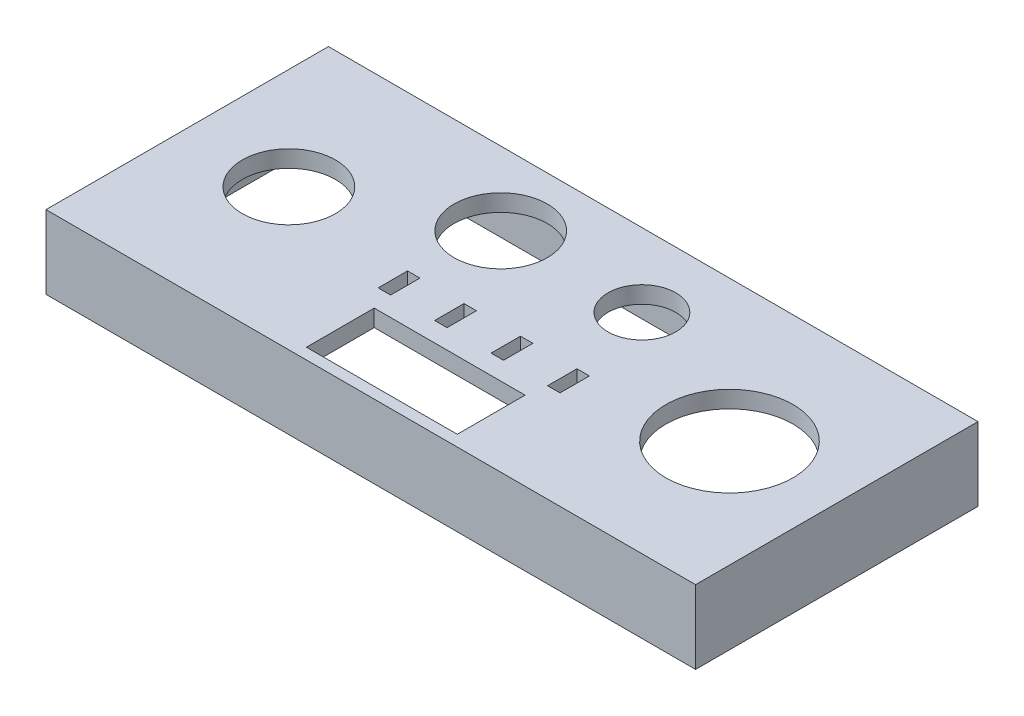
ISO-10303-21;
HEADER;
FILE_DESCRIPTION(('STEP AP214'),'2;1');
FILE_NAME('part.step','',(''),(''),'','','');
FILE_SCHEMA(('AUTOMOTIVE_DESIGN { 1 0 10303 214 1 1 1 1 }'));
ENDSEC;
DATA;
#1=APPLICATION_CONTEXT('core data for automotive mechanical design processes');
#2=APPLICATION_PROTOCOL_DEFINITION('international standard','automotive_design',2000,#1);
#3=PRODUCT_CONTEXT('',#1,'mechanical');
#4=PRODUCT('Part','Part','',(#3));
#5=PRODUCT_RELATED_PRODUCT_CATEGORY('part','',(#4));
#6=PRODUCT_DEFINITION_FORMATION('','',#4);
#7=PRODUCT_DEFINITION_CONTEXT('part definition',#1,'design');
#8=PRODUCT_DEFINITION('design','',#6,#7);
#9=PRODUCT_DEFINITION_SHAPE('','',#8);
#10=(LENGTH_UNIT() NAMED_UNIT(*) SI_UNIT(.MILLI.,.METRE.));
#11=(NAMED_UNIT(*) PLANE_ANGLE_UNIT() SI_UNIT($,.RADIAN.));
#12=(NAMED_UNIT(*) SI_UNIT($,.STERADIAN.) SOLID_ANGLE_UNIT());
#13=UNCERTAINTY_MEASURE_WITH_UNIT(LENGTH_MEASURE(1.E-05),#10,'distance_accuracy_value','');
#14=(GEOMETRIC_REPRESENTATION_CONTEXT(3) GLOBAL_UNCERTAINTY_ASSIGNED_CONTEXT((#13)) GLOBAL_UNIT_ASSIGNED_CONTEXT((#10,
#11,#12)) REPRESENTATION_CONTEXT('',''));
#15=CARTESIAN_POINT('',(0.,0.,0.));
#16=DIRECTION('',(0.,0.,1.));
#17=DIRECTION('',(1.,0.,0.));
#18=AXIS2_PLACEMENT_3D('',#15,#16,#17);
#19=CARTESIAN_POINT('',(57.5,13.,-25.));
#20=DIRECTION('',(-1.,0.,0.));
#21=DIRECTION('',(0.,0.,1.));
#22=AXIS2_PLACEMENT_3D('',#19,#20,#21);
#23=PLANE('',#22);
#24=DIRECTION('',(0.,0.,-1.));
#25=VECTOR('',#24,1.);
#26=CARTESIAN_POINT('',(57.5,0.,-25.));
#27=LINE('',#26,#25);
#28=CARTESIAN_POINT('',(57.5,0.,25.));
#29=VERTEX_POINT('',#28);
#30=CARTESIAN_POINT('',(57.5,0.,-25.));
#31=VERTEX_POINT('',#30);
#32=EDGE_CURVE('E424',#29,#31,#27,.T.);
#33=ORIENTED_EDGE('',*,*,#32,.T.);
#34=DIRECTION('',(0.,-1.,0.));
#35=VECTOR('',#34,1.);
#36=CARTESIAN_POINT('',(57.5,13.,-25.));
#37=LINE('',#36,#35);
#38=CARTESIAN_POINT('',(57.5,13.,-25.));
#39=VERTEX_POINT('',#38);
#40=EDGE_CURVE('E471',#39,#31,#37,.T.);
#41=ORIENTED_EDGE('',*,*,#40,.F.);
#42=DIRECTION('',(0.,0.,-1.));
#43=VECTOR('',#42,1.);
#44=CARTESIAN_POINT('',(57.5,13.,-25.));
#45=LINE('',#44,#43);
#46=CARTESIAN_POINT('',(57.5,13.,25.));
#47=VERTEX_POINT('',#46);
#48=EDGE_CURVE('E434',#47,#39,#45,.T.);
#49=ORIENTED_EDGE('',*,*,#48,.F.);
#50=DIRECTION('',(0.,-1.,0.));
#51=VECTOR('',#50,1.);
#52=CARTESIAN_POINT('',(57.5,13.,25.));
#53=LINE('',#52,#51);
#54=EDGE_CURVE('E448',#47,#29,#53,.T.);
#55=ORIENTED_EDGE('',*,*,#54,.T.);
#56=EDGE_LOOP('',(#33,#41,#49,#55));
#57=FACE_BOUND('',#56,.T.);
#58=ADVANCED_FACE('F39',(#57),#23,.F.);
#59=CARTESIAN_POINT('',(-57.5,13.,-25.));
#60=DIRECTION('',(0.,0.,1.));
#61=DIRECTION('',(1.,0.,0.));
#62=AXIS2_PLACEMENT_3D('',#59,#60,#61);
#63=PLANE('',#62);
#64=DIRECTION('',(-1.,0.,0.));
#65=VECTOR('',#64,1.);
#66=CARTESIAN_POINT('',(-57.5,0.,-25.));
#67=LINE('',#66,#65);
#68=CARTESIAN_POINT('',(-57.5,0.,-25.));
#69=VERTEX_POINT('',#68);
#70=EDGE_CURVE('E452',#31,#69,#67,.T.);
#71=ORIENTED_EDGE('',*,*,#70,.T.);
#72=DIRECTION('',(0.,-1.,0.));
#73=VECTOR('',#72,1.);
#74=CARTESIAN_POINT('',(-57.5,13.,-25.));
#75=LINE('',#74,#73);
#76=CARTESIAN_POINT('',(-57.5,13.,-25.));
#77=VERTEX_POINT('',#76);
#78=EDGE_CURVE('E467',#77,#69,#75,.T.);
#79=ORIENTED_EDGE('',*,*,#78,.F.);
#80=DIRECTION('',(-1.,0.,0.));
#81=VECTOR('',#80,1.);
#82=CARTESIAN_POINT('',(-57.5,13.,-25.));
#83=LINE('',#82,#81);
#84=EDGE_CURVE('E438',#39,#77,#83,.T.);
#85=ORIENTED_EDGE('',*,*,#84,.F.);
#86=ORIENTED_EDGE('',*,*,#40,.T.);
#87=EDGE_LOOP('',(#71,#79,#85,#86));
#88=FACE_BOUND('',#87,.T.);
#89=ADVANCED_FACE('F597',(#88),#63,.F.);
#90=CARTESIAN_POINT('',(-57.5,13.,-25.));
#91=DIRECTION('',(1.,0.,0.));
#92=DIRECTION('',(0.,0.,-1.));
#93=AXIS2_PLACEMENT_3D('',#90,#91,#92);
#94=PLANE('',#93);
#95=DIRECTION('',(0.,0.,1.));
#96=VECTOR('',#95,1.);
#97=CARTESIAN_POINT('',(-57.5,0.,-25.));
#98=LINE('',#97,#96);
#99=CARTESIAN_POINT('',(-57.5,0.,25.));
#100=VERTEX_POINT('',#99);
#101=EDGE_CURVE('E455',#69,#100,#98,.T.);
#102=ORIENTED_EDGE('',*,*,#101,.T.);
#103=DIRECTION('',(0.,-1.,0.));
#104=VECTOR('',#103,1.);
#105=CARTESIAN_POINT('',(-57.5,13.,25.));
#106=LINE('',#105,#104);
#107=CARTESIAN_POINT('',(-57.5,13.,25.));
#108=VERTEX_POINT('',#107);
#109=EDGE_CURVE('E463',#108,#100,#106,.T.);
#110=ORIENTED_EDGE('',*,*,#109,.F.);
#111=DIRECTION('',(0.,0.,1.));
#112=VECTOR('',#111,1.);
#113=CARTESIAN_POINT('',(-57.5,13.,-25.));
#114=LINE('',#113,#112);
#115=EDGE_CURVE('E442',#77,#108,#114,.T.);
#116=ORIENTED_EDGE('',*,*,#115,.F.);
#117=ORIENTED_EDGE('',*,*,#78,.T.);
#118=EDGE_LOOP('',(#102,#110,#116,#117));
#119=FACE_BOUND('',#118,.T.);
#120=ADVANCED_FACE('F602',(#119),#94,.F.);
#121=CARTESIAN_POINT('',(-57.5,13.,25.));
#122=DIRECTION('',(0.,0.,-1.));
#123=DIRECTION('',(-1.,0.,0.));
#124=AXIS2_PLACEMENT_3D('',#121,#122,#123);
#125=PLANE('',#124);
#126=DIRECTION('',(1.,0.,0.));
#127=VECTOR('',#126,1.);
#128=CARTESIAN_POINT('',(-57.5,0.,25.));
#129=LINE('',#128,#127);
#130=EDGE_CURVE('E439',#100,#29,#129,.T.);
#131=ORIENTED_EDGE('',*,*,#130,.T.);
#132=ORIENTED_EDGE('',*,*,#54,.F.);
#133=DIRECTION('',(1.,0.,0.));
#134=VECTOR('',#133,1.);
#135=CARTESIAN_POINT('',(-57.5,13.,25.));
#136=LINE('',#135,#134);
#137=EDGE_CURVE('E445',#108,#47,#136,.T.);
#138=ORIENTED_EDGE('',*,*,#137,.F.);
#139=ORIENTED_EDGE('',*,*,#109,.T.);
#140=EDGE_LOOP('',(#131,#132,#138,#139));
#141=FACE_BOUND('',#140,.T.);
#142=ADVANCED_FACE('F568',(#141),#125,.F.);
#143=CARTESIAN_POINT('',(0.,13.,0.));
#144=DIRECTION('',(0.,1.,0.));
#145=DIRECTION('',(0.,0.,1.));
#146=AXIS2_PLACEMENT_3D('',#143,#144,#145);
#147=PLANE('',#146);
#148=CARTESIAN_POINT('',(-39.5,13.,0.));
#149=DIRECTION('',(0.,1.,0.));
#150=DIRECTION('',(0.,0.,1.));
#151=AXIS2_PLACEMENT_3D('',#148,#149,#150);
#152=CIRCLE('',#151,8.25);
#153=CARTESIAN_POINT('',(-39.5,13.,8.25));
#154=VERTEX_POINT('',#153);
#155=EDGE_CURVE('E376',#154,#154,#152,.T.);
#156=ORIENTED_EDGE('',*,*,#155,.F.);
#157=EDGE_LOOP('',(#156));
#158=FACE_BOUND('',#157,.T.);
#159=DIRECTION('',(0.,0.,-1.));
#160=VECTOR('',#159,1.);
#161=CARTESIAN_POINT('',(13.35,13.,11.0398770165398));
#162=LINE('',#161,#160);
#163=CARTESIAN_POINT('',(13.35,13.,23.0398770165398));
#164=VERTEX_POINT('',#163);
#165=CARTESIAN_POINT('',(13.35,13.,11.0398770165398));
#166=VERTEX_POINT('',#165);
#167=EDGE_CURVE('E55',#164,#166,#162,.T.);
#168=ORIENTED_EDGE('',*,*,#167,.F.);
#169=DIRECTION('',(1.,0.,0.));
#170=VECTOR('',#169,1.);
#171=CARTESIAN_POINT('',(-13.35,13.,23.0398770165398));
#172=LINE('',#171,#170);
#173=CARTESIAN_POINT('',(-13.35,13.,23.0398770165398));
#174=VERTEX_POINT('',#173);
#175=EDGE_CURVE('E307',#174,#164,#172,.T.);
#176=ORIENTED_EDGE('',*,*,#175,.F.);
#177=DIRECTION('',(0.,0.,1.));
#178=VECTOR('',#177,1.);
#179=CARTESIAN_POINT('',(-13.35,13.,11.0398770165398));
#180=LINE('',#179,#178);
#181=CARTESIAN_POINT('',(-13.35,13.,11.0398770165398));
#182=VERTEX_POINT('',#181);
#183=EDGE_CURVE('E303',#182,#174,#180,.T.);
#184=ORIENTED_EDGE('',*,*,#183,.F.);
#185=DIRECTION('',(-1.,0.,0.));
#186=VECTOR('',#185,1.);
#187=CARTESIAN_POINT('',(-13.35,13.,11.0398770165398));
#188=LINE('',#187,#186);
#189=EDGE_CURVE('E298',#166,#182,#188,.T.);
#190=ORIENTED_EDGE('',*,*,#189,.F.);
#191=EDGE_LOOP('',(#168,#176,#184,#190));
#192=FACE_BOUND('',#191,.T.);
#193=DIRECTION('',(0.,0.,1.));
#194=VECTOR('',#193,1.);
#195=CARTESIAN_POINT('',(13.9,13.,2.4));
#196=LINE('',#195,#194);
#197=CARTESIAN_POINT('',(13.9,13.,2.4));
#198=VERTEX_POINT('',#197);
#199=CARTESIAN_POINT('',(13.9,13.,7.6));
#200=VERTEX_POINT('',#199);
#201=EDGE_CURVE('E63',#198,#200,#196,.T.);
#202=ORIENTED_EDGE('',*,*,#201,.F.);
#203=DIRECTION('',(-1.,0.,0.));
#204=VECTOR('',#203,1.);
#205=CARTESIAN_POINT('',(16.1,13.,2.4));
#206=LINE('',#205,#204);
#207=CARTESIAN_POINT('',(16.1,13.,2.4));
#208=VERTEX_POINT('',#207);
#209=EDGE_CURVE('E334',#208,#198,#206,.T.);
#210=ORIENTED_EDGE('',*,*,#209,.F.);
#211=DIRECTION('',(0.,0.,-1.));
#212=VECTOR('',#211,1.);
#213=CARTESIAN_POINT('',(16.1,13.,2.4));
#214=LINE('',#213,#212);
#215=CARTESIAN_POINT('',(16.1,13.,7.6));
#216=VERTEX_POINT('',#215);
#217=EDGE_CURVE('E330',#216,#208,#214,.T.);
#218=ORIENTED_EDGE('',*,*,#217,.F.);
#219=DIRECTION('',(1.,0.,0.));
#220=VECTOR('',#219,1.);
#221=CARTESIAN_POINT('',(16.1,13.,7.6));
#222=LINE('',#221,#220);
#223=EDGE_CURVE('E326',#200,#216,#222,.T.);
#224=ORIENTED_EDGE('',*,*,#223,.F.);
#225=EDGE_LOOP('',(#202,#210,#218,#224));
#226=FACE_BOUND('',#225,.T.);
#227=DIRECTION('',(0.,0.,1.));
#228=VECTOR('',#227,1.);
#229=CARTESIAN_POINT('',(3.9,13.,2.4));
#230=LINE('',#229,#228);
#231=CARTESIAN_POINT('',(3.9,13.,2.4));
#232=VERTEX_POINT('',#231);
#233=CARTESIAN_POINT('',(3.9,13.,7.6));
#234=VERTEX_POINT('',#233);
#235=EDGE_CURVE('E249',#232,#234,#230,.T.);
#236=ORIENTED_EDGE('',*,*,#235,.F.);
#237=DIRECTION('',(-1.,0.,0.));
#238=VECTOR('',#237,1.);
#239=CARTESIAN_POINT('',(6.1,13.,2.4));
#240=LINE('',#239,#238);
#241=CARTESIAN_POINT('',(6.1,13.,2.4));
#242=VERTEX_POINT('',#241);
#243=EDGE_CURVE('E254',#242,#232,#240,.T.);
#244=ORIENTED_EDGE('',*,*,#243,.F.);
#245=DIRECTION('',(0.,0.,-1.));
#246=VECTOR('',#245,1.);
#247=CARTESIAN_POINT('',(6.1,13.,2.4));
#248=LINE('',#247,#246);
#249=CARTESIAN_POINT('',(6.1,13.,7.6));
#250=VERTEX_POINT('',#249);
#251=EDGE_CURVE('E231',#250,#242,#248,.T.);
#252=ORIENTED_EDGE('',*,*,#251,.F.);
#253=DIRECTION('',(1.,0.,0.));
#254=VECTOR('',#253,1.);
#255=CARTESIAN_POINT('',(6.1,13.,7.6));
#256=LINE('',#255,#254);
#257=EDGE_CURVE('E243',#234,#250,#256,.T.);
#258=ORIENTED_EDGE('',*,*,#257,.F.);
#259=EDGE_LOOP('',(#236,#244,#252,#258));
#260=FACE_BOUND('',#259,.T.);
#261=DIRECTION('',(0.,0.,-1.));
#262=VECTOR('',#261,1.);
#263=CARTESIAN_POINT('',(-3.9,13.,2.4));
#264=LINE('',#263,#262);
#265=CARTESIAN_POINT('',(-3.9,13.,7.6));
#266=VERTEX_POINT('',#265);
#267=CARTESIAN_POINT('',(-3.9,13.,2.4));
#268=VERTEX_POINT('',#267);
#269=EDGE_CURVE('E268',#266,#268,#264,.T.);
#270=ORIENTED_EDGE('',*,*,#269,.F.);
#271=DIRECTION('',(1.,0.,0.));
#272=VECTOR('',#271,1.);
#273=CARTESIAN_POINT('',(-6.1,13.,7.6));
#274=LINE('',#273,#272);
#275=CARTESIAN_POINT('',(-6.1,13.,7.6));
#276=VERTEX_POINT('',#275);
#277=EDGE_CURVE('E279',#276,#266,#274,.T.);
#278=ORIENTED_EDGE('',*,*,#277,.F.);
#279=DIRECTION('',(0.,0.,1.));
#280=VECTOR('',#279,1.);
#281=CARTESIAN_POINT('',(-6.1,13.,2.4));
#282=LINE('',#281,#280);
#283=CARTESIAN_POINT('',(-6.1,13.,2.4));
#284=VERTEX_POINT('',#283);
#285=EDGE_CURVE('E275',#284,#276,#282,.T.);
#286=ORIENTED_EDGE('',*,*,#285,.F.);
#287=DIRECTION('',(-1.,0.,0.));
#288=VECTOR('',#287,1.);
#289=CARTESIAN_POINT('',(-6.1,13.,2.4));
#290=LINE('',#289,#288);
#291=EDGE_CURVE('E271',#268,#284,#290,.T.);
#292=ORIENTED_EDGE('',*,*,#291,.F.);
#293=EDGE_LOOP('',(#270,#278,#286,#292));
#294=FACE_BOUND('',#293,.T.);
#295=DIRECTION('',(0.,0.,-1.));
#296=VECTOR('',#295,1.);
#297=CARTESIAN_POINT('',(-13.9,13.,7.6));
#298=LINE('',#297,#296);
#299=CARTESIAN_POINT('',(-13.9,13.,7.6));
#300=VERTEX_POINT('',#299);
#301=CARTESIAN_POINT('',(-13.9,13.,2.4));
#302=VERTEX_POINT('',#301);
#303=EDGE_CURVE('E357',#300,#302,#298,.T.);
#304=ORIENTED_EDGE('',*,*,#303,.F.);
#305=DIRECTION('',(1.,0.,0.));
#306=VECTOR('',#305,1.);
#307=CARTESIAN_POINT('',(-16.1,13.,7.6));
#308=LINE('',#307,#306);
#309=CARTESIAN_POINT('',(-16.1,13.,7.6));
#310=VERTEX_POINT('',#309);
#311=EDGE_CURVE('E368',#310,#300,#308,.T.);
#312=ORIENTED_EDGE('',*,*,#311,.F.);
#313=DIRECTION('',(0.,0.,1.));
#314=VECTOR('',#313,1.);
#315=CARTESIAN_POINT('',(-16.1,13.,7.6));
#316=LINE('',#315,#314);
#317=CARTESIAN_POINT('',(-16.1,13.,2.4));
#318=VERTEX_POINT('',#317);
#319=EDGE_CURVE('E364',#318,#310,#316,.T.);
#320=ORIENTED_EDGE('',*,*,#319,.F.);
#321=DIRECTION('',(-1.,0.,0.));
#322=VECTOR('',#321,1.);
#323=CARTESIAN_POINT('',(-16.1,13.,2.4));
#324=LINE('',#323,#322);
#325=EDGE_CURVE('E360',#302,#318,#324,.T.);
#326=ORIENTED_EDGE('',*,*,#325,.F.);
#327=EDGE_LOOP('',(#304,#312,#320,#326));
#328=FACE_BOUND('',#327,.T.);
#329=CARTESIAN_POINT('',(38.5,13.,0.));
#330=DIRECTION('',(0.,1.,0.));
#331=DIRECTION('',(0.,0.,1.));
#332=AXIS2_PLACEMENT_3D('',#329,#330,#331);
#333=CIRCLE('',#332,11.25);
#334=CARTESIAN_POINT('',(38.5,13.,11.25));
#335=VERTEX_POINT('',#334);
#336=EDGE_CURVE('E353',#335,#335,#333,.T.);
#337=ORIENTED_EDGE('',*,*,#336,.F.);
#338=EDGE_LOOP('',(#337));
#339=FACE_BOUND('',#338,.T.);
#340=CARTESIAN_POINT('',(-14.,13.,-12.));
#341=DIRECTION('',(0.,1.,0.));
#342=DIRECTION('',(0.,0.,1.));
#343=AXIS2_PLACEMENT_3D('',#340,#341,#342);
#344=CIRCLE('',#343,8.25);
#345=CARTESIAN_POINT('',(-14.,13.,-3.75));
#346=VERTEX_POINT('',#345);
#347=EDGE_CURVE('E349',#346,#346,#344,.T.);
#348=ORIENTED_EDGE('',*,*,#347,.F.);
#349=EDGE_LOOP('',(#348));
#350=FACE_BOUND('',#349,.T.);
#351=CARTESIAN_POINT('',(11.,13.,-12.));
#352=DIRECTION('',(0.,1.,0.));
#353=DIRECTION('',(0.,0.,1.));
#354=AXIS2_PLACEMENT_3D('',#351,#352,#353);
#355=CIRCLE('',#354,6.);
#356=CARTESIAN_POINT('',(11.,13.,-6.));
#357=VERTEX_POINT('',#356);
#358=EDGE_CURVE('E315',#357,#357,#355,.T.);
#359=ORIENTED_EDGE('',*,*,#358,.F.);
#360=EDGE_LOOP('',(#359));
#361=FACE_BOUND('',#360,.T.);
#362=ORIENTED_EDGE('',*,*,#48,.T.);
#363=ORIENTED_EDGE('',*,*,#84,.T.);
#364=ORIENTED_EDGE('',*,*,#115,.T.);
#365=ORIENTED_EDGE('',*,*,#137,.T.);
#366=EDGE_LOOP('',(#362,#363,#364,#365));
#367=FACE_BOUND('',#366,.T.);
#368=ADVANCED_FACE('F251',(#158,#192,#226,#260,#294,#328,#339,#350,#361,#367),#147,.T.);
#369=CARTESIAN_POINT('',(0.,0.,0.));
#370=DIRECTION('',(0.,1.,0.));
#371=DIRECTION('',(0.,0.,1.));
#372=AXIS2_PLACEMENT_3D('',#369,#370,#371);
#373=PLANE('',#372);
#374=DIRECTION('',(-1.,0.,0.));
#375=VECTOR('',#374,1.);
#376=CARTESIAN_POINT('',(-56.5,0.,24.));
#377=LINE('',#376,#375);
#378=CARTESIAN_POINT('',(56.5,0.,24.));
#379=VERTEX_POINT('',#378);
#380=CARTESIAN_POINT('',(-56.5,0.,24.));
#381=VERTEX_POINT('',#380);
#382=EDGE_CURVE('E410',#379,#381,#377,.T.);
#383=ORIENTED_EDGE('',*,*,#382,.F.);
#384=DIRECTION('',(0.,0.,1.));
#385=VECTOR('',#384,1.);
#386=CARTESIAN_POINT('',(56.5,0.,24.));
#387=LINE('',#386,#385);
#388=CARTESIAN_POINT('',(56.5,0.,-24.));
#389=VERTEX_POINT('',#388);
#390=EDGE_CURVE('E407',#389,#379,#387,.T.);
#391=ORIENTED_EDGE('',*,*,#390,.F.);
#392=DIRECTION('',(1.,0.,0.));
#393=VECTOR('',#392,1.);
#394=CARTESIAN_POINT('',(-56.5,0.,-24.));
#395=LINE('',#394,#393);
#396=CARTESIAN_POINT('',(-56.5,0.,-24.));
#397=VERTEX_POINT('',#396);
#398=EDGE_CURVE('E394',#397,#389,#395,.T.);
#399=ORIENTED_EDGE('',*,*,#398,.F.);
#400=DIRECTION('',(0.,0.,-1.));
#401=VECTOR('',#400,1.);
#402=CARTESIAN_POINT('',(-56.5,0.,24.));
#403=LINE('',#402,#401);
#404=EDGE_CURVE('E414',#381,#397,#403,.T.);
#405=ORIENTED_EDGE('',*,*,#404,.F.);
#406=EDGE_LOOP('',(#383,#391,#399,#405));
#407=FACE_BOUND('',#406,.T.);
#408=ORIENTED_EDGE('',*,*,#32,.F.);
#409=ORIENTED_EDGE('',*,*,#130,.F.);
#410=ORIENTED_EDGE('',*,*,#101,.F.);
#411=ORIENTED_EDGE('',*,*,#70,.F.);
#412=EDGE_LOOP('',(#408,#409,#410,#411));
#413=FACE_BOUND('',#412,.T.);
#414=ADVANCED_FACE('F567',(#407,#413),#373,.F.);
#415=CARTESIAN_POINT('',(56.5,10.,24.));
#416=DIRECTION('',(1.,0.,0.));
#417=DIRECTION('',(0.,0.,-1.));
#418=AXIS2_PLACEMENT_3D('',#415,#416,#417);
#419=PLANE('',#418);
#420=ORIENTED_EDGE('',*,*,#390,.T.);
#421=DIRECTION('',(0.,-1.,0.));
#422=VECTOR('',#421,1.);
#423=CARTESIAN_POINT('',(56.5,10.,24.));
#424=LINE('',#423,#422);
#425=CARTESIAN_POINT('',(56.5,10.,24.));
#426=VERTEX_POINT('',#425);
#427=EDGE_CURVE('E406',#426,#379,#424,.T.);
#428=ORIENTED_EDGE('',*,*,#427,.F.);
#429=DIRECTION('',(0.,0.,1.));
#430=VECTOR('',#429,1.);
#431=CARTESIAN_POINT('',(56.5,10.,24.));
#432=LINE('',#431,#430);
#433=CARTESIAN_POINT('',(56.5,10.,-24.));
#434=VERTEX_POINT('',#433);
#435=EDGE_CURVE('E389',#434,#426,#432,.T.);
#436=ORIENTED_EDGE('',*,*,#435,.F.);
#437=DIRECTION('',(0.,-1.,0.));
#438=VECTOR('',#437,1.);
#439=CARTESIAN_POINT('',(56.5,10.,-24.));
#440=LINE('',#439,#438);
#441=EDGE_CURVE('E421',#434,#389,#440,.T.);
#442=ORIENTED_EDGE('',*,*,#441,.T.);
#443=EDGE_LOOP('',(#420,#428,#436,#442));
#444=FACE_BOUND('',#443,.T.);
#445=ADVANCED_FACE('F626',(#444),#419,.F.);
#446=CARTESIAN_POINT('',(-56.5,10.,-24.));
#447=DIRECTION('',(0.,0.,-1.));
#448=DIRECTION('',(-1.,0.,0.));
#449=AXIS2_PLACEMENT_3D('',#446,#447,#448);
#450=PLANE('',#449);
#451=ORIENTED_EDGE('',*,*,#398,.T.);
#452=ORIENTED_EDGE('',*,*,#441,.F.);
#453=DIRECTION('',(1.,0.,0.));
#454=VECTOR('',#453,1.);
#455=CARTESIAN_POINT('',(-56.5,10.,-24.));
#456=LINE('',#455,#454);
#457=CARTESIAN_POINT('',(-56.5,10.,-24.));
#458=VERTEX_POINT('',#457);
#459=EDGE_CURVE('E402',#458,#434,#456,.T.);
#460=ORIENTED_EDGE('',*,*,#459,.F.);
#461=DIRECTION('',(0.,-1.,0.));
#462=VECTOR('',#461,1.);
#463=CARTESIAN_POINT('',(-56.5,10.,-24.));
#464=LINE('',#463,#462);
#465=EDGE_CURVE('E425',#458,#397,#464,.T.);
#466=ORIENTED_EDGE('',*,*,#465,.T.);
#467=EDGE_LOOP('',(#451,#452,#460,#466));
#468=FACE_BOUND('',#467,.T.);
#469=ADVANCED_FACE('F631',(#468),#450,.F.);
#470=CARTESIAN_POINT('',(-56.5,10.,24.));
#471=DIRECTION('',(-1.,0.,0.));
#472=DIRECTION('',(0.,0.,1.));
#473=AXIS2_PLACEMENT_3D('',#470,#471,#472);
#474=PLANE('',#473);
#475=ORIENTED_EDGE('',*,*,#404,.T.);
#476=ORIENTED_EDGE('',*,*,#465,.F.);
#477=DIRECTION('',(0.,0.,-1.));
#478=VECTOR('',#477,1.);
#479=CARTESIAN_POINT('',(-56.5,10.,24.));
#480=LINE('',#479,#478);
#481=CARTESIAN_POINT('',(-56.5,10.,24.));
#482=VERTEX_POINT('',#481);
#483=EDGE_CURVE('E398',#482,#458,#480,.T.);
#484=ORIENTED_EDGE('',*,*,#483,.F.);
#485=DIRECTION('',(0.,-1.,0.));
#486=VECTOR('',#485,1.);
#487=CARTESIAN_POINT('',(-56.5,10.,24.));
#488=LINE('',#487,#486);
#489=EDGE_CURVE('E428',#482,#381,#488,.T.);
#490=ORIENTED_EDGE('',*,*,#489,.T.);
#491=EDGE_LOOP('',(#475,#476,#484,#490));
#492=FACE_BOUND('',#491,.T.);
#493=ADVANCED_FACE('F636',(#492),#474,.F.);
#494=CARTESIAN_POINT('',(-56.5,10.,24.));
#495=DIRECTION('',(0.,0.,1.));
#496=DIRECTION('',(1.,0.,0.));
#497=AXIS2_PLACEMENT_3D('',#494,#495,#496);
#498=PLANE('',#497);
#499=ORIENTED_EDGE('',*,*,#382,.T.);
#500=ORIENTED_EDGE('',*,*,#489,.F.);
#501=DIRECTION('',(-1.,0.,0.));
#502=VECTOR('',#501,1.);
#503=CARTESIAN_POINT('',(-56.5,10.,24.));
#504=LINE('',#503,#502);
#505=EDGE_CURVE('E393',#426,#482,#504,.T.);
#506=ORIENTED_EDGE('',*,*,#505,.F.);
#507=ORIENTED_EDGE('',*,*,#427,.T.);
#508=EDGE_LOOP('',(#499,#500,#506,#507));
#509=FACE_BOUND('',#508,.T.);
#510=ADVANCED_FACE('F633',(#509),#498,.F.);
#511=CARTESIAN_POINT('',(0.,10.,0.));
#512=DIRECTION('',(0.,-1.,0.));
#513=DIRECTION('',(0.,0.,-1.));
#514=AXIS2_PLACEMENT_3D('',#511,#512,#513);
#515=PLANE('',#514);
#516=CARTESIAN_POINT('',(-39.5,10.,0.));
#517=DIRECTION('',(0.,-1.,0.));
#518=DIRECTION('',(0.,0.,-1.));
#519=AXIS2_PLACEMENT_3D('',#516,#517,#518);
#520=CIRCLE('',#519,8.25);
#521=CARTESIAN_POINT('',(-39.5,10.,-8.24999999999999));
#522=VERTEX_POINT('',#521);
#523=EDGE_CURVE('E42',#522,#522,#520,.T.);
#524=ORIENTED_EDGE('',*,*,#523,.F.);
#525=EDGE_LOOP('',(#524));
#526=FACE_BOUND('',#525,.T.);
#527=DIRECTION('',(0.,0.,1.));
#528=VECTOR('',#527,1.);
#529=CARTESIAN_POINT('',(13.35,10.,0.));
#530=LINE('',#529,#528);
#531=CARTESIAN_POINT('',(13.35,10.,11.0398770165398));
#532=VERTEX_POINT('',#531);
#533=CARTESIAN_POINT('',(13.35,10.,23.0398770165398));
#534=VERTEX_POINT('',#533);
#535=EDGE_CURVE('E11',#532,#534,#530,.T.);
#536=ORIENTED_EDGE('',*,*,#535,.F.);
#537=DIRECTION('',(1.,0.,0.));
#538=VECTOR('',#537,1.);
#539=CARTESIAN_POINT('',(0.,10.,11.0398770165398));
#540=LINE('',#539,#538);
#541=CARTESIAN_POINT('',(-13.35,10.,11.0398770165398));
#542=VERTEX_POINT('',#541);
#543=EDGE_CURVE('E537',#542,#532,#540,.T.);
#544=ORIENTED_EDGE('',*,*,#543,.F.);
#545=DIRECTION('',(0.,0.,-1.));
#546=VECTOR('',#545,1.);
#547=CARTESIAN_POINT('',(-13.35,10.,0.));
#548=LINE('',#547,#546);
#549=CARTESIAN_POINT('',(-13.35,10.,23.0398770165398));
#550=VERTEX_POINT('',#549);
#551=EDGE_CURVE('E540',#550,#542,#548,.T.);
#552=ORIENTED_EDGE('',*,*,#551,.F.);
#553=DIRECTION('',(-1.,0.,0.));
#554=VECTOR('',#553,1.);
#555=CARTESIAN_POINT('',(0.,10.,23.0398770165398));
#556=LINE('',#555,#554);
#557=EDGE_CURVE('E48',#534,#550,#556,.T.);
#558=ORIENTED_EDGE('',*,*,#557,.F.);
#559=EDGE_LOOP('',(#536,#544,#552,#558));
#560=FACE_BOUND('',#559,.T.);
#561=DIRECTION('',(0.,0.,-1.));
#562=VECTOR('',#561,1.);
#563=CARTESIAN_POINT('',(13.9,10.,0.));
#564=LINE('',#563,#562);
#565=CARTESIAN_POINT('',(13.9,10.,7.6));
#566=VERTEX_POINT('',#565);
#567=CARTESIAN_POINT('',(13.9,10.,2.4));
#568=VERTEX_POINT('',#567);
#569=EDGE_CURVE('E534',#566,#568,#564,.T.);
#570=ORIENTED_EDGE('',*,*,#569,.F.);
#571=DIRECTION('',(-1.,0.,0.));
#572=VECTOR('',#571,1.);
#573=CARTESIAN_POINT('',(0.,10.,7.6));
#574=LINE('',#573,#572);
#575=CARTESIAN_POINT('',(16.1,10.,7.6));
#576=VERTEX_POINT('',#575);
#577=EDGE_CURVE('E524',#576,#566,#574,.T.);
#578=ORIENTED_EDGE('',*,*,#577,.F.);
#579=DIRECTION('',(0.,0.,1.));
#580=VECTOR('',#579,1.);
#581=CARTESIAN_POINT('',(16.1,10.,0.));
#582=LINE('',#581,#580);
#583=CARTESIAN_POINT('',(16.1,10.,2.4));
#584=VERTEX_POINT('',#583);
#585=EDGE_CURVE('E527',#584,#576,#582,.T.);
#586=ORIENTED_EDGE('',*,*,#585,.F.);
#587=DIRECTION('',(1.,0.,0.));
#588=VECTOR('',#587,1.);
#589=CARTESIAN_POINT('',(0.,10.,2.4));
#590=LINE('',#589,#588);
#591=EDGE_CURVE('E531',#568,#584,#590,.T.);
#592=ORIENTED_EDGE('',*,*,#591,.F.);
#593=EDGE_LOOP('',(#570,#578,#586,#592));
#594=FACE_BOUND('',#593,.T.);
#595=DIRECTION('',(0.,0.,-1.));
#596=VECTOR('',#595,1.);
#597=CARTESIAN_POINT('',(3.9,10.,0.));
#598=LINE('',#597,#596);
#599=CARTESIAN_POINT('',(3.9,10.,7.6));
#600=VERTEX_POINT('',#599);
#601=CARTESIAN_POINT('',(3.9,10.,2.4));
#602=VERTEX_POINT('',#601);
#603=EDGE_CURVE('E521',#600,#602,#598,.T.);
#604=ORIENTED_EDGE('',*,*,#603,.F.);
#605=DIRECTION('',(-1.,0.,0.));
#606=VECTOR('',#605,1.);
#607=CARTESIAN_POINT('',(0.,10.,7.6));
#608=LINE('',#607,#606);
#609=CARTESIAN_POINT('',(6.1,10.,7.6));
#610=VERTEX_POINT('',#609);
#611=EDGE_CURVE('E513',#610,#600,#608,.T.);
#612=ORIENTED_EDGE('',*,*,#611,.F.);
#613=DIRECTION('',(0.,0.,1.));
#614=VECTOR('',#613,1.);
#615=CARTESIAN_POINT('',(6.1,10.,0.));
#616=LINE('',#615,#614);
#617=CARTESIAN_POINT('',(6.1,10.,2.4));
#618=VERTEX_POINT('',#617);
#619=EDGE_CURVE('E234',#618,#610,#616,.T.);
#620=ORIENTED_EDGE('',*,*,#619,.F.);
#621=DIRECTION('',(1.,0.,0.));
#622=VECTOR('',#621,1.);
#623=CARTESIAN_POINT('',(0.,10.,2.4));
#624=LINE('',#623,#622);
#625=EDGE_CURVE('E518',#602,#618,#624,.T.);
#626=ORIENTED_EDGE('',*,*,#625,.F.);
#627=EDGE_LOOP('',(#604,#612,#620,#626));
#628=FACE_BOUND('',#627,.T.);
#629=DIRECTION('',(0.,0.,1.));
#630=VECTOR('',#629,1.);
#631=CARTESIAN_POINT('',(-3.9,10.,0.));
#632=LINE('',#631,#630);
#633=CARTESIAN_POINT('',(-3.9,10.,2.4));
#634=VERTEX_POINT('',#633);
#635=CARTESIAN_POINT('',(-3.9,10.,7.6));
#636=VERTEX_POINT('',#635);
#637=EDGE_CURVE('E510',#634,#636,#632,.T.);
#638=ORIENTED_EDGE('',*,*,#637,.F.);
#639=DIRECTION('',(1.,0.,0.));
#640=VECTOR('',#639,1.);
#641=CARTESIAN_POINT('',(0.,10.,2.4));
#642=LINE('',#641,#640);
#643=CARTESIAN_POINT('',(-6.1,10.,2.4));
#644=VERTEX_POINT('',#643);
#645=EDGE_CURVE('E500',#644,#634,#642,.T.);
#646=ORIENTED_EDGE('',*,*,#645,.F.);
#647=DIRECTION('',(0.,0.,-1.));
#648=VECTOR('',#647,1.);
#649=CARTESIAN_POINT('',(-6.1,10.,0.));
#650=LINE('',#649,#648);
#651=CARTESIAN_POINT('',(-6.1,10.,7.6));
#652=VERTEX_POINT('',#651);
#653=EDGE_CURVE('E503',#652,#644,#650,.T.);
#654=ORIENTED_EDGE('',*,*,#653,.F.);
#655=DIRECTION('',(-1.,0.,0.));
#656=VECTOR('',#655,1.);
#657=CARTESIAN_POINT('',(0.,10.,7.6));
#658=LINE('',#657,#656);
#659=EDGE_CURVE('E507',#636,#652,#658,.T.);
#660=ORIENTED_EDGE('',*,*,#659,.F.);
#661=EDGE_LOOP('',(#638,#646,#654,#660));
#662=FACE_BOUND('',#661,.T.);
#663=DIRECTION('',(0.,0.,1.));
#664=VECTOR('',#663,1.);
#665=CARTESIAN_POINT('',(-13.9,10.,0.));
#666=LINE('',#665,#664);
#667=CARTESIAN_POINT('',(-13.9,10.,2.4));
#668=VERTEX_POINT('',#667);
#669=CARTESIAN_POINT('',(-13.9,10.,7.6));
#670=VERTEX_POINT('',#669);
#671=EDGE_CURVE('E497',#668,#670,#666,.T.);
#672=ORIENTED_EDGE('',*,*,#671,.F.);
#673=DIRECTION('',(1.,0.,0.));
#674=VECTOR('',#673,1.);
#675=CARTESIAN_POINT('',(0.,10.,2.4));
#676=LINE('',#675,#674);
#677=CARTESIAN_POINT('',(-16.1,10.,2.4));
#678=VERTEX_POINT('',#677);
#679=EDGE_CURVE('E475',#678,#668,#676,.T.);
#680=ORIENTED_EDGE('',*,*,#679,.F.);
#681=DIRECTION('',(0.,0.,-1.));
#682=VECTOR('',#681,1.);
#683=CARTESIAN_POINT('',(-16.1,10.,0.));
#684=LINE('',#683,#682);
#685=CARTESIAN_POINT('',(-16.1,10.,7.6));
#686=VERTEX_POINT('',#685);
#687=EDGE_CURVE('E490',#686,#678,#684,.T.);
#688=ORIENTED_EDGE('',*,*,#687,.F.);
#689=DIRECTION('',(-1.,0.,0.));
#690=VECTOR('',#689,1.);
#691=CARTESIAN_POINT('',(0.,10.,7.6));
#692=LINE('',#691,#690);
#693=EDGE_CURVE('E494',#670,#686,#692,.T.);
#694=ORIENTED_EDGE('',*,*,#693,.F.);
#695=EDGE_LOOP('',(#672,#680,#688,#694));
#696=FACE_BOUND('',#695,.T.);
#697=CARTESIAN_POINT('',(38.5,10.,0.));
#698=DIRECTION('',(0.,-1.,0.));
#699=DIRECTION('',(0.,0.,-1.));
#700=AXIS2_PLACEMENT_3D('',#697,#698,#699);
#701=CIRCLE('',#700,11.25);
#702=CARTESIAN_POINT('',(38.5,10.,-11.25));
#703=VERTEX_POINT('',#702);
#704=EDGE_CURVE('E484',#703,#703,#701,.T.);
#705=ORIENTED_EDGE('',*,*,#704,.F.);
#706=EDGE_LOOP('',(#705));
#707=FACE_BOUND('',#706,.T.);
#708=CARTESIAN_POINT('',(-14.,10.,-12.));
#709=DIRECTION('',(0.,-1.,0.));
#710=DIRECTION('',(0.,0.,-1.));
#711=AXIS2_PLACEMENT_3D('',#708,#709,#710);
#712=CIRCLE('',#711,8.25);
#713=CARTESIAN_POINT('',(-14.,10.,-20.25));
#714=VERTEX_POINT('',#713);
#715=EDGE_CURVE('E480',#714,#714,#712,.T.);
#716=ORIENTED_EDGE('',*,*,#715,.F.);
#717=EDGE_LOOP('',(#716));
#718=FACE_BOUND('',#717,.T.);
#719=CARTESIAN_POINT('',(11.,10.,-12.));
#720=DIRECTION('',(0.,-1.,0.));
#721=DIRECTION('',(0.,0.,-1.));
#722=AXIS2_PLACEMENT_3D('',#719,#720,#721);
#723=CIRCLE('',#722,6.);
#724=CARTESIAN_POINT('',(11.,10.,-18.));
#725=VERTEX_POINT('',#724);
#726=EDGE_CURVE('E476',#725,#725,#723,.T.);
#727=ORIENTED_EDGE('',*,*,#726,.F.);
#728=EDGE_LOOP('',(#727));
#729=FACE_BOUND('',#728,.T.);
#730=ORIENTED_EDGE('',*,*,#435,.T.);
#731=ORIENTED_EDGE('',*,*,#505,.T.);
#732=ORIENTED_EDGE('',*,*,#483,.T.);
#733=ORIENTED_EDGE('',*,*,#459,.T.);
#734=EDGE_LOOP('',(#730,#731,#732,#733));
#735=FACE_BOUND('',#734,.T.);
#736=ADVANCED_FACE('F558',(#526,#560,#594,#628,#662,#696,#707,#718,#729,#735),#515,.T.);
#737=CARTESIAN_POINT('',(11.,3.,-12.));
#738=DIRECTION('',(0.,1.,0.));
#739=DIRECTION('',(0.,0.,1.));
#740=AXIS2_PLACEMENT_3D('',#737,#738,#739);
#741=CYLINDRICAL_SURFACE('',#740,6.);
#742=ORIENTED_EDGE('',*,*,#726,.T.);
#743=EDGE_LOOP('',(#742));
#744=FACE_BOUND('',#743,.T.);
#745=ORIENTED_EDGE('',*,*,#358,.T.);
#746=EDGE_LOOP('',(#745));
#747=FACE_BOUND('',#746,.T.);
#748=ADVANCED_FACE('F646',(#744,#747),#741,.F.);
#749=CARTESIAN_POINT('',(-14.,3.,-12.));
#750=DIRECTION('',(0.,1.,0.));
#751=DIRECTION('',(0.,0.,1.));
#752=AXIS2_PLACEMENT_3D('',#749,#750,#751);
#753=CYLINDRICAL_SURFACE('',#752,8.25);
#754=ORIENTED_EDGE('',*,*,#715,.T.);
#755=EDGE_LOOP('',(#754));
#756=FACE_BOUND('',#755,.T.);
#757=ORIENTED_EDGE('',*,*,#347,.T.);
#758=EDGE_LOOP('',(#757));
#759=FACE_BOUND('',#758,.T.);
#760=ADVANCED_FACE('F652',(#756,#759),#753,.F.);
#761=CARTESIAN_POINT('',(38.5,3.,0.));
#762=DIRECTION('',(0.,1.,0.));
#763=DIRECTION('',(0.,0.,1.));
#764=AXIS2_PLACEMENT_3D('',#761,#762,#763);
#765=CYLINDRICAL_SURFACE('',#764,11.25);
#766=ORIENTED_EDGE('',*,*,#704,.T.);
#767=EDGE_LOOP('',(#766));
#768=FACE_BOUND('',#767,.T.);
#769=ORIENTED_EDGE('',*,*,#336,.T.);
#770=EDGE_LOOP('',(#769));
#771=FACE_BOUND('',#770,.T.);
#772=ADVANCED_FACE('F648',(#768,#771),#765,.F.);
#773=CARTESIAN_POINT('',(-13.9,3.,7.6));
#774=DIRECTION('',(1.,0.,0.));
#775=DIRECTION('',(0.,0.,-1.));
#776=AXIS2_PLACEMENT_3D('',#773,#774,#775);
#777=PLANE('',#776);
#778=ORIENTED_EDGE('',*,*,#671,.T.);
#779=DIRECTION('',(0.,1.,0.));
#780=VECTOR('',#779,1.);
#781=CARTESIAN_POINT('',(-13.9,3.,7.6));
#782=LINE('',#781,#780);
#783=EDGE_CURVE('E373',#670,#300,#782,.T.);
#784=ORIENTED_EDGE('',*,*,#783,.T.);
#785=ORIENTED_EDGE('',*,*,#303,.T.);
#786=DIRECTION('',(0.,1.,0.));
#787=VECTOR('',#786,1.);
#788=CARTESIAN_POINT('',(-13.9,3.,2.4));
#789=LINE('',#788,#787);
#790=EDGE_CURVE('E372',#668,#302,#789,.T.);
#791=ORIENTED_EDGE('',*,*,#790,.F.);
#792=EDGE_LOOP('',(#778,#784,#785,#791));
#793=FACE_BOUND('',#792,.T.);
#794=ADVANCED_FACE('F651',(#793),#777,.F.);
#795=CARTESIAN_POINT('',(-16.1,3.,7.6));
#796=DIRECTION('',(0.,0.,1.));
#797=DIRECTION('',(1.,0.,0.));
#798=AXIS2_PLACEMENT_3D('',#795,#796,#797);
#799=PLANE('',#798);
#800=ORIENTED_EDGE('',*,*,#693,.T.);
#801=DIRECTION('',(0.,1.,0.));
#802=VECTOR('',#801,1.);
#803=CARTESIAN_POINT('',(-16.1,3.,7.6));
#804=LINE('',#803,#802);
#805=EDGE_CURVE('E377',#686,#310,#804,.T.);
#806=ORIENTED_EDGE('',*,*,#805,.T.);
#807=ORIENTED_EDGE('',*,*,#311,.T.);
#808=ORIENTED_EDGE('',*,*,#783,.F.);
#809=EDGE_LOOP('',(#800,#806,#807,#808));
#810=FACE_BOUND('',#809,.T.);
#811=ADVANCED_FACE('F656',(#810),#799,.F.);
#812=CARTESIAN_POINT('',(-16.1,3.,7.6));
#813=DIRECTION('',(-1.,0.,0.));
#814=DIRECTION('',(0.,0.,1.));
#815=AXIS2_PLACEMENT_3D('',#812,#813,#814);
#816=PLANE('',#815);
#817=ORIENTED_EDGE('',*,*,#687,.T.);
#818=DIRECTION('',(0.,1.,0.));
#819=VECTOR('',#818,1.);
#820=CARTESIAN_POINT('',(-16.1,3.,2.4));
#821=LINE('',#820,#819);
#822=EDGE_CURVE('E380',#678,#318,#821,.T.);
#823=ORIENTED_EDGE('',*,*,#822,.T.);
#824=ORIENTED_EDGE('',*,*,#319,.T.);
#825=ORIENTED_EDGE('',*,*,#805,.F.);
#826=EDGE_LOOP('',(#817,#823,#824,#825));
#827=FACE_BOUND('',#826,.T.);
#828=ADVANCED_FACE('F662',(#827),#816,.F.);
#829=CARTESIAN_POINT('',(-16.1,3.,2.4));
#830=DIRECTION('',(0.,0.,-1.));
#831=DIRECTION('',(-1.,0.,0.));
#832=AXIS2_PLACEMENT_3D('',#829,#830,#831);
#833=PLANE('',#832);
#834=ORIENTED_EDGE('',*,*,#679,.T.);
#835=ORIENTED_EDGE('',*,*,#790,.T.);
#836=ORIENTED_EDGE('',*,*,#325,.T.);
#837=ORIENTED_EDGE('',*,*,#822,.F.);
#838=EDGE_LOOP('',(#834,#835,#836,#837));
#839=FACE_BOUND('',#838,.T.);
#840=ADVANCED_FACE('F658',(#839),#833,.F.);
#841=CARTESIAN_POINT('',(-3.9,3.,2.4));
#842=DIRECTION('',(1.,0.,0.));
#843=DIRECTION('',(0.,0.,-1.));
#844=AXIS2_PLACEMENT_3D('',#841,#842,#843);
#845=PLANE('',#844);
#846=ORIENTED_EDGE('',*,*,#637,.T.);
#847=DIRECTION('',(0.,1.,0.));
#848=VECTOR('',#847,1.);
#849=CARTESIAN_POINT('',(-3.9,3.,7.6));
#850=LINE('',#849,#848);
#851=EDGE_CURVE('E284',#636,#266,#850,.T.);
#852=ORIENTED_EDGE('',*,*,#851,.T.);
#853=ORIENTED_EDGE('',*,*,#269,.T.);
#854=DIRECTION('',(0.,1.,0.));
#855=VECTOR('',#854,1.);
#856=CARTESIAN_POINT('',(-3.9,3.,2.4));
#857=LINE('',#856,#855);
#858=EDGE_CURVE('E283',#634,#268,#857,.T.);
#859=ORIENTED_EDGE('',*,*,#858,.F.);
#860=EDGE_LOOP('',(#846,#852,#853,#859));
#861=FACE_BOUND('',#860,.T.);
#862=ADVANCED_FACE('F661',(#861),#845,.F.);
#863=CARTESIAN_POINT('',(-6.1,3.,7.6));
#864=DIRECTION('',(0.,0.,1.));
#865=DIRECTION('',(1.,0.,0.));
#866=AXIS2_PLACEMENT_3D('',#863,#864,#865);
#867=PLANE('',#866);
#868=ORIENTED_EDGE('',*,*,#659,.T.);
#869=DIRECTION('',(0.,1.,0.));
#870=VECTOR('',#869,1.);
#871=CARTESIAN_POINT('',(-6.1,3.,7.6));
#872=LINE('',#871,#870);
#873=EDGE_CURVE('E287',#652,#276,#872,.T.);
#874=ORIENTED_EDGE('',*,*,#873,.T.);
#875=ORIENTED_EDGE('',*,*,#277,.T.);
#876=ORIENTED_EDGE('',*,*,#851,.F.);
#877=EDGE_LOOP('',(#868,#874,#875,#876));
#878=FACE_BOUND('',#877,.T.);
#879=ADVANCED_FACE('F693',(#878),#867,.F.);
#880=CARTESIAN_POINT('',(-6.1,3.,2.4));
#881=DIRECTION('',(-1.,0.,0.));
#882=DIRECTION('',(0.,0.,1.));
#883=AXIS2_PLACEMENT_3D('',#880,#881,#882);
#884=PLANE('',#883);
#885=ORIENTED_EDGE('',*,*,#653,.T.);
#886=DIRECTION('',(0.,1.,0.));
#887=VECTOR('',#886,1.);
#888=CARTESIAN_POINT('',(-6.1,3.,2.4));
#889=LINE('',#888,#887);
#890=EDGE_CURVE('E290',#644,#284,#889,.T.);
#891=ORIENTED_EDGE('',*,*,#890,.T.);
#892=ORIENTED_EDGE('',*,*,#285,.T.);
#893=ORIENTED_EDGE('',*,*,#873,.F.);
#894=EDGE_LOOP('',(#885,#891,#892,#893));
#895=FACE_BOUND('',#894,.T.);
#896=ADVANCED_FACE('F696',(#895),#884,.F.);
#897=CARTESIAN_POINT('',(-6.1,3.,2.4));
#898=DIRECTION('',(0.,0.,-1.));
#899=DIRECTION('',(-1.,0.,0.));
#900=AXIS2_PLACEMENT_3D('',#897,#898,#899);
#901=PLANE('',#900);
#902=ORIENTED_EDGE('',*,*,#645,.T.);
#903=ORIENTED_EDGE('',*,*,#858,.T.);
#904=ORIENTED_EDGE('',*,*,#291,.T.);
#905=ORIENTED_EDGE('',*,*,#890,.F.);
#906=EDGE_LOOP('',(#902,#903,#904,#905));
#907=FACE_BOUND('',#906,.T.);
#908=ADVANCED_FACE('F691',(#907),#901,.F.);
#909=CARTESIAN_POINT('',(3.9,3.,2.4));
#910=DIRECTION('',(-1.,0.,0.));
#911=DIRECTION('',(0.,0.,1.));
#912=AXIS2_PLACEMENT_3D('',#909,#910,#911);
#913=PLANE('',#912);
#914=ORIENTED_EDGE('',*,*,#603,.T.);
#915=DIRECTION('',(0.,1.,0.));
#916=VECTOR('',#915,1.);
#917=CARTESIAN_POINT('',(3.9,3.,2.4));
#918=LINE('',#917,#916);
#919=EDGE_CURVE('E261',#602,#232,#918,.T.);
#920=ORIENTED_EDGE('',*,*,#919,.T.);
#921=ORIENTED_EDGE('',*,*,#235,.T.);
#922=DIRECTION('',(0.,1.,0.));
#923=VECTOR('',#922,1.);
#924=CARTESIAN_POINT('',(3.9,3.,7.6));
#925=LINE('',#924,#923);
#926=EDGE_CURVE('E239',#600,#234,#925,.T.);
#927=ORIENTED_EDGE('',*,*,#926,.F.);
#928=EDGE_LOOP('',(#914,#920,#921,#927));
#929=FACE_BOUND('',#928,.T.);
#930=ADVANCED_FACE('F688',(#929),#913,.F.);
#931=CARTESIAN_POINT('',(6.1,3.,2.4));
#932=DIRECTION('',(0.,0.,-1.));
#933=DIRECTION('',(-1.,0.,0.));
#934=AXIS2_PLACEMENT_3D('',#931,#932,#933);
#935=PLANE('',#934);
#936=ORIENTED_EDGE('',*,*,#625,.T.);
#937=DIRECTION('',(0.,1.,0.));
#938=VECTOR('',#937,1.);
#939=CARTESIAN_POINT('',(6.1,3.,2.4));
#940=LINE('',#939,#938);
#941=EDGE_CURVE('E238',#618,#242,#940,.T.);
#942=ORIENTED_EDGE('',*,*,#941,.T.);
#943=ORIENTED_EDGE('',*,*,#243,.T.);
#944=ORIENTED_EDGE('',*,*,#919,.F.);
#945=EDGE_LOOP('',(#936,#942,#943,#944));
#946=FACE_BOUND('',#945,.T.);
#947=ADVANCED_FACE('F684',(#946),#935,.F.);
#948=CARTESIAN_POINT('',(6.1,3.,2.4));
#949=DIRECTION('',(1.,0.,0.));
#950=DIRECTION('',(0.,0.,-1.));
#951=AXIS2_PLACEMENT_3D('',#948,#949,#950);
#952=PLANE('',#951);
#953=ORIENTED_EDGE('',*,*,#619,.T.);
#954=DIRECTION('',(0.,1.,0.));
#955=VECTOR('',#954,1.);
#956=CARTESIAN_POINT('',(6.1,3.,7.6));
#957=LINE('',#956,#955);
#958=EDGE_CURVE('E226',#610,#250,#957,.T.);
#959=ORIENTED_EDGE('',*,*,#958,.T.);
#960=ORIENTED_EDGE('',*,*,#251,.T.);
#961=ORIENTED_EDGE('',*,*,#941,.F.);
#962=EDGE_LOOP('',(#953,#959,#960,#961));
#963=FACE_BOUND('',#962,.T.);
#964=ADVANCED_FACE('F228',(#963),#952,.F.);
#965=CARTESIAN_POINT('',(6.1,3.,7.6));
#966=DIRECTION('',(0.,0.,1.));
#967=DIRECTION('',(1.,0.,0.));
#968=AXIS2_PLACEMENT_3D('',#965,#966,#967);
#969=PLANE('',#968);
#970=ORIENTED_EDGE('',*,*,#611,.T.);
#971=ORIENTED_EDGE('',*,*,#926,.T.);
#972=ORIENTED_EDGE('',*,*,#257,.T.);
#973=ORIENTED_EDGE('',*,*,#958,.F.);
#974=EDGE_LOOP('',(#970,#971,#972,#973));
#975=FACE_BOUND('',#974,.T.);
#976=ADVANCED_FACE('F244',(#975),#969,.F.);
#977=CARTESIAN_POINT('',(13.9,3.,2.4));
#978=DIRECTION('',(-1.,0.,0.));
#979=DIRECTION('',(0.,0.,1.));
#980=AXIS2_PLACEMENT_3D('',#977,#978,#979);
#981=PLANE('',#980);
#982=ORIENTED_EDGE('',*,*,#569,.T.);
#983=DIRECTION('',(0.,1.,0.));
#984=VECTOR('',#983,1.);
#985=CARTESIAN_POINT('',(13.9,3.,2.4));
#986=LINE('',#985,#984);
#987=EDGE_CURVE('E299',#568,#198,#986,.T.);
#988=ORIENTED_EDGE('',*,*,#987,.T.);
#989=ORIENTED_EDGE('',*,*,#201,.T.);
#990=DIRECTION('',(0.,1.,0.));
#991=VECTOR('',#990,1.);
#992=CARTESIAN_POINT('',(13.9,3.,7.6));
#993=LINE('',#992,#991);
#994=EDGE_CURVE('E338',#566,#200,#993,.T.);
#995=ORIENTED_EDGE('',*,*,#994,.F.);
#996=EDGE_LOOP('',(#982,#988,#989,#995));
#997=FACE_BOUND('',#996,.T.);
#998=ADVANCED_FACE('F578',(#997),#981,.F.);
#999=CARTESIAN_POINT('',(16.1,3.,2.4));
#1000=DIRECTION('',(0.,0.,-1.));
#1001=DIRECTION('',(-1.,0.,0.));
#1002=AXIS2_PLACEMENT_3D('',#999,#1000,#1001);
#1003=PLANE('',#1002);
#1004=ORIENTED_EDGE('',*,*,#591,.T.);
#1005=DIRECTION('',(0.,1.,0.));
#1006=VECTOR('',#1005,1.);
#1007=CARTESIAN_POINT('',(16.1,3.,2.4));
#1008=LINE('',#1007,#1006);
#1009=EDGE_CURVE('E341',#584,#208,#1008,.T.);
#1010=ORIENTED_EDGE('',*,*,#1009,.T.);
#1011=ORIENTED_EDGE('',*,*,#209,.T.);
#1012=ORIENTED_EDGE('',*,*,#987,.F.);
#1013=EDGE_LOOP('',(#1004,#1010,#1011,#1012));
#1014=FACE_BOUND('',#1013,.T.);
#1015=ADVANCED_FACE('F585',(#1014),#1003,.F.);
#1016=CARTESIAN_POINT('',(16.1,3.,2.4));
#1017=DIRECTION('',(1.,0.,0.));
#1018=DIRECTION('',(0.,0.,-1.));
#1019=AXIS2_PLACEMENT_3D('',#1016,#1017,#1018);
#1020=PLANE('',#1019);
#1021=ORIENTED_EDGE('',*,*,#585,.T.);
#1022=DIRECTION('',(0.,1.,0.));
#1023=VECTOR('',#1022,1.);
#1024=CARTESIAN_POINT('',(16.1,3.,7.6));
#1025=LINE('',#1024,#1023);
#1026=EDGE_CURVE('E344',#576,#216,#1025,.T.);
#1027=ORIENTED_EDGE('',*,*,#1026,.T.);
#1028=ORIENTED_EDGE('',*,*,#217,.T.);
#1029=ORIENTED_EDGE('',*,*,#1009,.F.);
#1030=EDGE_LOOP('',(#1021,#1027,#1028,#1029));
#1031=FACE_BOUND('',#1030,.T.);
#1032=ADVANCED_FACE('F587',(#1031),#1020,.F.);
#1033=CARTESIAN_POINT('',(16.1,3.,7.6));
#1034=DIRECTION('',(0.,0.,1.));
#1035=DIRECTION('',(1.,0.,0.));
#1036=AXIS2_PLACEMENT_3D('',#1033,#1034,#1035);
#1037=PLANE('',#1036);
#1038=ORIENTED_EDGE('',*,*,#577,.T.);
#1039=ORIENTED_EDGE('',*,*,#994,.T.);
#1040=ORIENTED_EDGE('',*,*,#223,.T.);
#1041=ORIENTED_EDGE('',*,*,#1026,.F.);
#1042=EDGE_LOOP('',(#1038,#1039,#1040,#1041));
#1043=FACE_BOUND('',#1042,.T.);
#1044=ADVANCED_FACE('F575',(#1043),#1037,.F.);
#1045=CARTESIAN_POINT('',(13.35,3.,11.0398770165398));
#1046=DIRECTION('',(1.,0.,0.));
#1047=DIRECTION('',(0.,0.,-1.));
#1048=AXIS2_PLACEMENT_3D('',#1045,#1046,#1047);
#1049=PLANE('',#1048);
#1050=ORIENTED_EDGE('',*,*,#535,.T.);
#1051=DIRECTION('',(0.,1.,0.));
#1052=VECTOR('',#1051,1.);
#1053=CARTESIAN_POINT('',(13.35,3.,23.0398770165398));
#1054=LINE('',#1053,#1052);
#1055=EDGE_CURVE('E312',#534,#164,#1054,.T.);
#1056=ORIENTED_EDGE('',*,*,#1055,.T.);
#1057=ORIENTED_EDGE('',*,*,#167,.T.);
#1058=DIRECTION('',(0.,1.,0.));
#1059=VECTOR('',#1058,1.);
#1060=CARTESIAN_POINT('',(13.35,3.,11.0398770165398));
#1061=LINE('',#1060,#1059);
#1062=EDGE_CURVE('E311',#532,#166,#1061,.T.);
#1063=ORIENTED_EDGE('',*,*,#1062,.F.);
#1064=EDGE_LOOP('',(#1050,#1056,#1057,#1063));
#1065=FACE_BOUND('',#1064,.T.);
#1066=ADVANCED_FACE('F563',(#1065),#1049,.F.);
#1067=CARTESIAN_POINT('',(-13.35,3.,23.0398770165398));
#1068=DIRECTION('',(0.,0.,1.));
#1069=DIRECTION('',(1.,0.,0.));
#1070=AXIS2_PLACEMENT_3D('',#1067,#1068,#1069);
#1071=PLANE('',#1070);
#1072=ORIENTED_EDGE('',*,*,#557,.T.);
#1073=DIRECTION('',(0.,1.,0.));
#1074=VECTOR('',#1073,1.);
#1075=CARTESIAN_POINT('',(-13.35,3.,23.0398770165398));
#1076=LINE('',#1075,#1074);
#1077=EDGE_CURVE('E316',#550,#174,#1076,.T.);
#1078=ORIENTED_EDGE('',*,*,#1077,.T.);
#1079=ORIENTED_EDGE('',*,*,#175,.T.);
#1080=ORIENTED_EDGE('',*,*,#1055,.F.);
#1081=EDGE_LOOP('',(#1072,#1078,#1079,#1080));
#1082=FACE_BOUND('',#1081,.T.);
#1083=ADVANCED_FACE('F549',(#1082),#1071,.F.);
#1084=CARTESIAN_POINT('',(-13.35,3.,11.0398770165398));
#1085=DIRECTION('',(-1.,0.,0.));
#1086=DIRECTION('',(0.,0.,1.));
#1087=AXIS2_PLACEMENT_3D('',#1084,#1085,#1086);
#1088=PLANE('',#1087);
#1089=ORIENTED_EDGE('',*,*,#551,.T.);
#1090=DIRECTION('',(0.,1.,0.));
#1091=VECTOR('',#1090,1.);
#1092=CARTESIAN_POINT('',(-13.35,3.,11.0398770165398));
#1093=LINE('',#1092,#1091);
#1094=EDGE_CURVE('E319',#542,#182,#1093,.T.);
#1095=ORIENTED_EDGE('',*,*,#1094,.T.);
#1096=ORIENTED_EDGE('',*,*,#183,.T.);
#1097=ORIENTED_EDGE('',*,*,#1077,.F.);
#1098=EDGE_LOOP('',(#1089,#1095,#1096,#1097));
#1099=FACE_BOUND('',#1098,.T.);
#1100=ADVANCED_FACE('F554',(#1099),#1088,.F.);
#1101=CARTESIAN_POINT('',(-13.35,3.,11.0398770165398));
#1102=DIRECTION('',(0.,0.,-1.));
#1103=DIRECTION('',(-1.,0.,0.));
#1104=AXIS2_PLACEMENT_3D('',#1101,#1102,#1103);
#1105=PLANE('',#1104);
#1106=ORIENTED_EDGE('',*,*,#543,.T.);
#1107=ORIENTED_EDGE('',*,*,#1062,.T.);
#1108=ORIENTED_EDGE('',*,*,#189,.T.);
#1109=ORIENTED_EDGE('',*,*,#1094,.F.);
#1110=EDGE_LOOP('',(#1106,#1107,#1108,#1109));
#1111=FACE_BOUND('',#1110,.T.);
#1112=ADVANCED_FACE('F561',(#1111),#1105,.F.);
#1113=CARTESIAN_POINT('',(-39.5,3.,0.));
#1114=DIRECTION('',(0.,1.,0.));
#1115=DIRECTION('',(0.,0.,1.));
#1116=AXIS2_PLACEMENT_3D('',#1113,#1114,#1115);
#1117=CYLINDRICAL_SURFACE('',#1116,8.25);
#1118=ORIENTED_EDGE('',*,*,#523,.T.);
#1119=EDGE_LOOP('',(#1118));
#1120=FACE_BOUND('',#1119,.T.);
#1121=ORIENTED_EDGE('',*,*,#155,.T.);
#1122=EDGE_LOOP('',(#1121));
#1123=FACE_BOUND('',#1122,.T.);
#1124=ADVANCED_FACE('F713',(#1120,#1123),#1117,.F.);
#1125=CLOSED_SHELL('',(#58,#89,#120,#142,#368,#414,#445,#469,#493,#510,#736,#748,#760,#772,#794,
#811,#828,#840,#862,#879,#896,#908,#930,#947,#964,#976,#998,#1015,#1032,#1044,#1066,#1083,#1100,
#1112,#1124));
#1126=MANIFOLD_SOLID_BREP('B2',#1125);
#1127=ADVANCED_BREP_SHAPE_REPRESENTATION('',(#18,#1126),#14);
#1128=SHAPE_DEFINITION_REPRESENTATION(#9,#1127);
ENDSEC;
END-ISO-10303-21;
